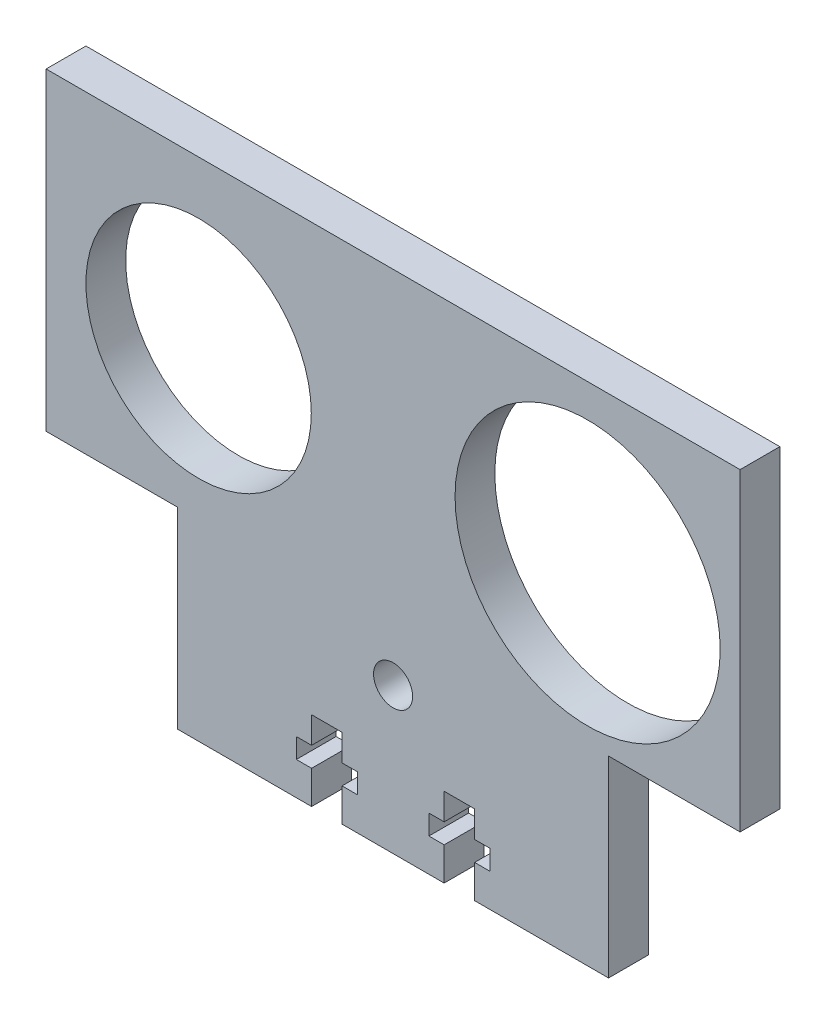
ISO-10303-21;
HEADER;
FILE_DESCRIPTION(('STEP AP214'),'2;1');
FILE_NAME('part.step','',(''),(''),'','','');
FILE_SCHEMA(('AUTOMOTIVE_DESIGN { 1 0 10303 214 1 1 1 1 }'));
ENDSEC;
DATA;
#1=APPLICATION_CONTEXT('core data for automotive mechanical design processes');
#2=APPLICATION_PROTOCOL_DEFINITION('international standard','automotive_design',2000,#1);
#3=PRODUCT_CONTEXT('',#1,'mechanical');
#4=PRODUCT('Part','Part','',(#3));
#5=PRODUCT_RELATED_PRODUCT_CATEGORY('part','',(#4));
#6=PRODUCT_DEFINITION_FORMATION('','',#4);
#7=PRODUCT_DEFINITION_CONTEXT('part definition',#1,'design');
#8=PRODUCT_DEFINITION('design','',#6,#7);
#9=PRODUCT_DEFINITION_SHAPE('','',#8);
#10=(LENGTH_UNIT() NAMED_UNIT(*) SI_UNIT(.MILLI.,.METRE.));
#11=(NAMED_UNIT(*) PLANE_ANGLE_UNIT() SI_UNIT($,.RADIAN.));
#12=(NAMED_UNIT(*) SI_UNIT($,.STERADIAN.) SOLID_ANGLE_UNIT());
#13=UNCERTAINTY_MEASURE_WITH_UNIT(LENGTH_MEASURE(1.E-05),#10,'distance_accuracy_value','');
#14=(GEOMETRIC_REPRESENTATION_CONTEXT(3) GLOBAL_UNCERTAINTY_ASSIGNED_CONTEXT((#13)) GLOBAL_UNIT_ASSIGNED_CONTEXT((#10,
#11,#12)) REPRESENTATION_CONTEXT('',''));
#15=CARTESIAN_POINT('',(0.,0.,0.));
#16=DIRECTION('',(0.,0.,1.));
#17=DIRECTION('',(1.,0.,0.));
#18=AXIS2_PLACEMENT_3D('',#15,#16,#17);
#19=CARTESIAN_POINT('',(-32.5,-22.,6.));
#20=DIRECTION('',(0.,1.,0.));
#21=DIRECTION('',(-1.,0.,0.));
#22=AXIS2_PLACEMENT_3D('',#19,#20,#21);
#23=PLANE('',#22);
#24=DIRECTION('',(1.,0.,0.));
#25=VECTOR('',#24,1.);
#26=CARTESIAN_POINT('',(-32.5,-22.,6.));
#27=LINE('',#26,#25);
#28=CARTESIAN_POINT('',(12.3,-22.,6.));
#29=VERTEX_POINT('',#28);
#30=CARTESIAN_POINT('',(32.5,-22.,6.));
#31=VERTEX_POINT('',#30);
#32=EDGE_CURVE('E465',#29,#31,#27,.T.);
#33=ORIENTED_EDGE('',*,*,#32,.F.);
#34=DIRECTION('',(0.,0.,1.));
#35=VECTOR('',#34,1.);
#36=CARTESIAN_POINT('',(12.3,-22.,0.));
#37=LINE('',#36,#35);
#38=CARTESIAN_POINT('',(12.3,-22.,0.));
#39=VERTEX_POINT('',#38);
#40=EDGE_CURVE('E336',#39,#29,#37,.T.);
#41=ORIENTED_EDGE('',*,*,#40,.F.);
#42=DIRECTION('',(1.,0.,0.));
#43=VECTOR('',#42,1.);
#44=CARTESIAN_POINT('',(-32.5,-22.,0.));
#45=LINE('',#44,#43);
#46=CARTESIAN_POINT('',(32.5,-22.,0.));
#47=VERTEX_POINT('',#46);
#48=EDGE_CURVE('E485',#39,#47,#45,.T.);
#49=ORIENTED_EDGE('',*,*,#48,.T.);
#50=DIRECTION('',(0.,0.,-1.));
#51=VECTOR('',#50,1.);
#52=CARTESIAN_POINT('',(32.5,-22.,6.));
#53=LINE('',#52,#51);
#54=EDGE_CURVE('E469',#31,#47,#53,.T.);
#55=ORIENTED_EDGE('',*,*,#54,.F.);
#56=EDGE_LOOP('',(#33,#41,#49,#55));
#57=FACE_BOUND('',#56,.T.);
#58=ADVANCED_FACE('F33',(#57),#23,.F.);
#59=CARTESIAN_POINT('',(-32.5,-22.,0.));
#60=VERTEX_POINT('',#59);
#61=CARTESIAN_POINT('',(-12.3,-22.,0.));
#62=VERTEX_POINT('',#61);
#63=EDGE_CURVE('E453',#60,#62,#45,.T.);
#64=ORIENTED_EDGE('',*,*,#63,.T.);
#65=DIRECTION('',(0.,0.,1.));
#66=VECTOR('',#65,1.);
#67=CARTESIAN_POINT('',(-12.3,-22.,0.));
#68=LINE('',#67,#66);
#69=CARTESIAN_POINT('',(-12.3,-22.,6.));
#70=VERTEX_POINT('',#69);
#71=EDGE_CURVE('E375',#62,#70,#68,.T.);
#72=ORIENTED_EDGE('',*,*,#71,.T.);
#73=CARTESIAN_POINT('',(-32.5,-22.,6.));
#74=VERTEX_POINT('',#73);
#75=EDGE_CURVE('E466',#74,#70,#27,.T.);
#76=ORIENTED_EDGE('',*,*,#75,.F.);
#77=DIRECTION('',(0.,0.,-1.));
#78=VECTOR('',#77,1.);
#79=CARTESIAN_POINT('',(-32.5,-22.,6.));
#80=LINE('',#79,#78);
#81=EDGE_CURVE('E491',#74,#60,#80,.T.);
#82=ORIENTED_EDGE('',*,*,#81,.T.);
#83=EDGE_LOOP('',(#64,#72,#76,#82));
#84=FACE_BOUND('',#83,.T.);
#85=ADVANCED_FACE('F554',(#84),#23,.F.);
#86=CARTESIAN_POINT('',(0.,0.,6.));
#87=DIRECTION('',(0.,0.,1.));
#88=DIRECTION('',(1.,0.,0.));
#89=AXIS2_PLACEMENT_3D('',#86,#87,#88);
#90=PLANE('',#89);
#91=DIRECTION('',(0.,1.,0.));
#92=VECTOR('',#91,1.);
#93=CARTESIAN_POINT('',(12.3,-22.,6.));
#94=LINE('',#93,#92);
#95=CARTESIAN_POINT('',(12.3,-17.,6.));
#96=VERTEX_POINT('',#95);
#97=EDGE_CURVE('E304',#29,#96,#94,.T.);
#98=ORIENTED_EDGE('',*,*,#97,.F.);
#99=ORIENTED_EDGE('',*,*,#32,.T.);
#100=DIRECTION('',(0.,1.,0.));
#101=VECTOR('',#100,1.);
#102=CARTESIAN_POINT('',(32.5,7.00000000000001,6.));
#103=LINE('',#102,#101);
#104=CARTESIAN_POINT('',(32.5,7.00000000000001,6.));
#105=VERTEX_POINT('',#104);
#106=EDGE_CURVE('E449',#31,#105,#103,.T.);
#107=ORIENTED_EDGE('',*,*,#106,.T.);
#108=DIRECTION('',(1.,0.,0.));
#109=VECTOR('',#108,1.);
#110=CARTESIAN_POINT('',(32.5,7.00000000000001,6.));
#111=LINE('',#110,#109);
#112=CARTESIAN_POINT('',(52.3449314192418,7.00000000000002,6.));
#113=VERTEX_POINT('',#112);
#114=EDGE_CURVE('E452',#105,#113,#111,.T.);
#115=ORIENTED_EDGE('',*,*,#114,.T.);
#116=DIRECTION('',(0.,1.,0.));
#117=VECTOR('',#116,1.);
#118=CARTESIAN_POINT('',(52.3449314192418,7.00000000000002,6.));
#119=LINE('',#118,#117);
#120=CARTESIAN_POINT('',(52.3449314192418,54.3449314192417,6.));
#121=VERTEX_POINT('',#120);
#122=EDGE_CURVE('E455',#113,#121,#119,.T.);
#123=ORIENTED_EDGE('',*,*,#122,.T.);
#124=DIRECTION('',(-1.,0.,0.));
#125=VECTOR('',#124,1.);
#126=CARTESIAN_POINT('',(-52.3449314192418,54.3449314192417,6.));
#127=LINE('',#126,#125);
#128=CARTESIAN_POINT('',(-52.3449314192418,54.3449314192417,6.));
#129=VERTEX_POINT('',#128);
#130=EDGE_CURVE('E457',#121,#129,#127,.T.);
#131=ORIENTED_EDGE('',*,*,#130,.T.);
#132=DIRECTION('',(0.,-1.,0.));
#133=VECTOR('',#132,1.);
#134=CARTESIAN_POINT('',(-52.3449314192418,7.,6.));
#135=LINE('',#134,#133);
#136=CARTESIAN_POINT('',(-52.3449314192418,7.,6.));
#137=VERTEX_POINT('',#136);
#138=EDGE_CURVE('E459',#129,#137,#135,.T.);
#139=ORIENTED_EDGE('',*,*,#138,.T.);
#140=DIRECTION('',(1.,0.,0.));
#141=VECTOR('',#140,1.);
#142=CARTESIAN_POINT('',(-32.5,7.,6.));
#143=LINE('',#142,#141);
#144=CARTESIAN_POINT('',(-32.5,7.,6.));
#145=VERTEX_POINT('',#144);
#146=EDGE_CURVE('E461',#137,#145,#143,.T.);
#147=ORIENTED_EDGE('',*,*,#146,.T.);
#148=DIRECTION('',(0.,-1.,0.));
#149=VECTOR('',#148,1.);
#150=CARTESIAN_POINT('',(-32.5,7.,6.));
#151=LINE('',#150,#149);
#152=EDGE_CURVE('E463',#145,#74,#151,.T.);
#153=ORIENTED_EDGE('',*,*,#152,.T.);
#154=ORIENTED_EDGE('',*,*,#75,.T.);
#155=DIRECTION('',(0.,-1.,0.));
#156=VECTOR('',#155,1.);
#157=CARTESIAN_POINT('',(-12.3,-22.,6.));
#158=LINE('',#157,#156);
#159=CARTESIAN_POINT('',(-12.3,-17.,6.));
#160=VERTEX_POINT('',#159);
#161=EDGE_CURVE('E323',#160,#70,#158,.T.);
#162=ORIENTED_EDGE('',*,*,#161,.F.);
#163=DIRECTION('',(1.,0.,0.));
#164=VECTOR('',#163,1.);
#165=CARTESIAN_POINT('',(-14.6,-17.,6.));
#166=LINE('',#165,#164);
#167=CARTESIAN_POINT('',(-14.6,-17.,6.));
#168=VERTEX_POINT('',#167);
#169=EDGE_CURVE('E346',#168,#160,#166,.T.);
#170=ORIENTED_EDGE('',*,*,#169,.F.);
#171=DIRECTION('',(0.,-1.,0.));
#172=VECTOR('',#171,1.);
#173=CARTESIAN_POINT('',(-14.6,-14.,6.));
#174=LINE('',#173,#172);
#175=CARTESIAN_POINT('',(-14.6,-14.,6.));
#176=VERTEX_POINT('',#175);
#177=EDGE_CURVE('E401',#176,#168,#174,.T.);
#178=ORIENTED_EDGE('',*,*,#177,.F.);
#179=DIRECTION('',(-1.,0.,0.));
#180=VECTOR('',#179,1.);
#181=CARTESIAN_POINT('',(-14.6,-14.,6.));
#182=LINE('',#181,#180);
#183=CARTESIAN_POINT('',(-12.3,-14.,6.));
#184=VERTEX_POINT('',#183);
#185=EDGE_CURVE('E398',#184,#176,#182,.T.);
#186=ORIENTED_EDGE('',*,*,#185,.F.);
#187=DIRECTION('',(0.,-1.,0.));
#188=VECTOR('',#187,1.);
#189=CARTESIAN_POINT('',(-12.3,-14.,6.));
#190=LINE('',#189,#188);
#191=CARTESIAN_POINT('',(-12.3,-10.,6.));
#192=VERTEX_POINT('',#191);
#193=EDGE_CURVE('E395',#192,#184,#190,.T.);
#194=ORIENTED_EDGE('',*,*,#193,.F.);
#195=DIRECTION('',(-1.,0.,0.));
#196=VECTOR('',#195,1.);
#197=CARTESIAN_POINT('',(-12.3,-10.,6.));
#198=LINE('',#197,#196);
#199=CARTESIAN_POINT('',(-7.7,-10.,6.));
#200=VERTEX_POINT('',#199);
#201=EDGE_CURVE('E392',#200,#192,#198,.T.);
#202=ORIENTED_EDGE('',*,*,#201,.F.);
#203=DIRECTION('',(0.,1.,0.));
#204=VECTOR('',#203,1.);
#205=CARTESIAN_POINT('',(-7.7,-14.,6.));
#206=LINE('',#205,#204);
#207=CARTESIAN_POINT('',(-7.7,-14.,6.));
#208=VERTEX_POINT('',#207);
#209=EDGE_CURVE('E389',#208,#200,#206,.T.);
#210=ORIENTED_EDGE('',*,*,#209,.F.);
#211=DIRECTION('',(-1.,0.,0.));
#212=VECTOR('',#211,1.);
#213=CARTESIAN_POINT('',(-7.7,-14.,6.));
#214=LINE('',#213,#212);
#215=CARTESIAN_POINT('',(-5.4,-14.,6.));
#216=VERTEX_POINT('',#215);
#217=EDGE_CURVE('E386',#216,#208,#214,.T.);
#218=ORIENTED_EDGE('',*,*,#217,.F.);
#219=DIRECTION('',(0.,1.,0.));
#220=VECTOR('',#219,1.);
#221=CARTESIAN_POINT('',(-5.4,-14.,6.));
#222=LINE('',#221,#220);
#223=CARTESIAN_POINT('',(-5.4,-17.,6.));
#224=VERTEX_POINT('',#223);
#225=EDGE_CURVE('E383',#224,#216,#222,.T.);
#226=ORIENTED_EDGE('',*,*,#225,.F.);
#227=DIRECTION('',(1.,0.,0.));
#228=VECTOR('',#227,1.);
#229=CARTESIAN_POINT('',(-7.7,-17.,6.));
#230=LINE('',#229,#228);
#231=CARTESIAN_POINT('',(-7.7,-17.,6.));
#232=VERTEX_POINT('',#231);
#233=EDGE_CURVE('E380',#232,#224,#230,.T.);
#234=ORIENTED_EDGE('',*,*,#233,.F.);
#235=DIRECTION('',(0.,1.,0.));
#236=VECTOR('',#235,1.);
#237=CARTESIAN_POINT('',(-7.69999999999999,-22.,6.));
#238=LINE('',#237,#236);
#239=CARTESIAN_POINT('',(-7.69999999999999,-22.,6.));
#240=VERTEX_POINT('',#239);
#241=EDGE_CURVE('E377',#240,#232,#238,.T.);
#242=ORIENTED_EDGE('',*,*,#241,.F.);
#243=CARTESIAN_POINT('',(7.7,-22.,6.));
#244=VERTEX_POINT('',#243);
#245=EDGE_CURVE('E470',#240,#244,#27,.T.);
#246=ORIENTED_EDGE('',*,*,#245,.T.);
#247=DIRECTION('',(0.,-1.,0.));
#248=VECTOR('',#247,1.);
#249=CARTESIAN_POINT('',(7.7,-22.,6.));
#250=LINE('',#249,#248);
#251=CARTESIAN_POINT('',(7.7,-17.,6.));
#252=VERTEX_POINT('',#251);
#253=EDGE_CURVE('E48',#252,#244,#250,.T.);
#254=ORIENTED_EDGE('',*,*,#253,.F.);
#255=DIRECTION('',(1.,0.,0.));
#256=VECTOR('',#255,1.);
#257=CARTESIAN_POINT('',(7.7,-17.,6.));
#258=LINE('',#257,#256);
#259=CARTESIAN_POINT('',(5.4,-17.,6.));
#260=VERTEX_POINT('',#259);
#261=EDGE_CURVE('E300',#260,#252,#258,.T.);
#262=ORIENTED_EDGE('',*,*,#261,.F.);
#263=DIRECTION('',(0.,-1.,0.));
#264=VECTOR('',#263,1.);
#265=CARTESIAN_POINT('',(5.4,-14.,6.));
#266=LINE('',#265,#264);
#267=CARTESIAN_POINT('',(5.4,-14.,6.));
#268=VERTEX_POINT('',#267);
#269=EDGE_CURVE('E298',#268,#260,#266,.T.);
#270=ORIENTED_EDGE('',*,*,#269,.F.);
#271=DIRECTION('',(-1.,0.,0.));
#272=VECTOR('',#271,1.);
#273=CARTESIAN_POINT('',(7.7,-14.,6.));
#274=LINE('',#273,#272);
#275=CARTESIAN_POINT('',(7.7,-14.,6.));
#276=VERTEX_POINT('',#275);
#277=EDGE_CURVE('E249',#276,#268,#274,.T.);
#278=ORIENTED_EDGE('',*,*,#277,.F.);
#279=DIRECTION('',(0.,-1.,0.));
#280=VECTOR('',#279,1.);
#281=CARTESIAN_POINT('',(7.7,-14.,6.));
#282=LINE('',#281,#280);
#283=CARTESIAN_POINT('',(7.7,-10.,6.));
#284=VERTEX_POINT('',#283);
#285=EDGE_CURVE('E269',#284,#276,#282,.T.);
#286=ORIENTED_EDGE('',*,*,#285,.F.);
#287=DIRECTION('',(-1.,0.,0.));
#288=VECTOR('',#287,1.);
#289=CARTESIAN_POINT('',(12.3,-9.99999999999999,6.));
#290=LINE('',#289,#288);
#291=CARTESIAN_POINT('',(12.3,-9.99999999999999,6.));
#292=VERTEX_POINT('',#291);
#293=EDGE_CURVE('E272',#292,#284,#290,.T.);
#294=ORIENTED_EDGE('',*,*,#293,.F.);
#295=DIRECTION('',(0.,1.,0.));
#296=VECTOR('',#295,1.);
#297=CARTESIAN_POINT('',(12.3,-14.,6.));
#298=LINE('',#297,#296);
#299=CARTESIAN_POINT('',(12.3,-14.,6.));
#300=VERTEX_POINT('',#299);
#301=EDGE_CURVE('E316',#300,#292,#298,.T.);
#302=ORIENTED_EDGE('',*,*,#301,.F.);
#303=DIRECTION('',(-1.,0.,0.));
#304=VECTOR('',#303,1.);
#305=CARTESIAN_POINT('',(14.6,-14.,6.));
#306=LINE('',#305,#304);
#307=CARTESIAN_POINT('',(14.6,-14.,6.));
#308=VERTEX_POINT('',#307);
#309=EDGE_CURVE('E313',#308,#300,#306,.T.);
#310=ORIENTED_EDGE('',*,*,#309,.F.);
#311=DIRECTION('',(0.,1.,0.));
#312=VECTOR('',#311,1.);
#313=CARTESIAN_POINT('',(14.6,-14.,6.));
#314=LINE('',#313,#312);
#315=CARTESIAN_POINT('',(14.6,-17.,6.));
#316=VERTEX_POINT('',#315);
#317=EDGE_CURVE('E310',#316,#308,#314,.T.);
#318=ORIENTED_EDGE('',*,*,#317,.F.);
#319=DIRECTION('',(1.,0.,0.));
#320=VECTOR('',#319,1.);
#321=CARTESIAN_POINT('',(14.6,-17.,6.));
#322=LINE('',#321,#320);
#323=EDGE_CURVE('E307',#96,#316,#322,.T.);
#324=ORIENTED_EDGE('',*,*,#323,.F.);
#325=EDGE_LOOP('',(#98,#99,#107,#115,#123,#131,#139,#147,#153,#154,#162,#170,#178,#186,#194,
#202,#210,#218,#226,#234,#242,#246,#254,#262,#270,#278,#286,#294,#302,#310,#318,#324));
#326=FACE_BOUND('',#325,.T.);
#327=CARTESIAN_POINT('',(-29.3449314192418,29.3449314192417,6.));
#328=DIRECTION('',(0.,0.,1.));
#329=DIRECTION('',(1.,0.,0.));
#330=AXIS2_PLACEMENT_3D('',#327,#328,#329);
#331=CIRCLE('',#330,17.);
#332=CARTESIAN_POINT('',(-12.3449314192418,29.3449314192417,6.));
#333=VERTEX_POINT('',#332);
#334=EDGE_CURVE('E437',#333,#333,#331,.T.);
#335=ORIENTED_EDGE('',*,*,#334,.F.);
#336=EDGE_LOOP('',(#335));
#337=FACE_BOUND('',#336,.T.);
#338=CARTESIAN_POINT('',(0.,0.,6.));
#339=DIRECTION('',(0.,0.,1.));
#340=DIRECTION('',(1.,0.,0.));
#341=AXIS2_PLACEMENT_3D('',#338,#339,#340);
#342=CIRCLE('',#341,2.95);
#343=CARTESIAN_POINT('',(2.95,0.,6.));
#344=VERTEX_POINT('',#343);
#345=EDGE_CURVE('E443',#344,#344,#342,.T.);
#346=ORIENTED_EDGE('',*,*,#345,.F.);
#347=EDGE_LOOP('',(#346));
#348=FACE_BOUND('',#347,.T.);
#349=CARTESIAN_POINT('',(29.3449314192418,29.3449314192417,6.));
#350=DIRECTION('',(0.,0.,1.));
#351=DIRECTION('',(1.,0.,0.));
#352=AXIS2_PLACEMENT_3D('',#349,#350,#351);
#353=CIRCLE('',#352,20.);
#354=CARTESIAN_POINT('',(49.3449314192418,29.3449314192417,6.));
#355=VERTEX_POINT('',#354);
#356=EDGE_CURVE('E431',#355,#355,#353,.T.);
#357=ORIENTED_EDGE('',*,*,#356,.F.);
#358=EDGE_LOOP('',(#357));
#359=FACE_BOUND('',#358,.T.);
#360=ADVANCED_FACE('F528',(#326,#337,#348,#359),#90,.T.);
#361=CARTESIAN_POINT('',(0.,0.,0.));
#362=DIRECTION('',(0.,0.,1.));
#363=DIRECTION('',(1.,0.,0.));
#364=AXIS2_PLACEMENT_3D('',#361,#362,#363);
#365=PLANE('',#364);
#366=ORIENTED_EDGE('',*,*,#48,.F.);
#367=DIRECTION('',(0.,1.,0.));
#368=VECTOR('',#367,1.);
#369=CARTESIAN_POINT('',(12.3,-22.,0.));
#370=LINE('',#369,#368);
#371=CARTESIAN_POINT('',(12.3,-17.,0.));
#372=VERTEX_POINT('',#371);
#373=EDGE_CURVE('E279',#39,#372,#370,.T.);
#374=ORIENTED_EDGE('',*,*,#373,.T.);
#375=DIRECTION('',(1.,0.,0.));
#376=VECTOR('',#375,1.);
#377=CARTESIAN_POINT('',(14.6,-17.,0.));
#378=LINE('',#377,#376);
#379=CARTESIAN_POINT('',(14.6,-17.,0.));
#380=VERTEX_POINT('',#379);
#381=EDGE_CURVE('E282',#372,#380,#378,.T.);
#382=ORIENTED_EDGE('',*,*,#381,.T.);
#383=DIRECTION('',(0.,1.,0.));
#384=VECTOR('',#383,1.);
#385=CARTESIAN_POINT('',(14.6,-14.,0.));
#386=LINE('',#385,#384);
#387=CARTESIAN_POINT('',(14.6,-14.,0.));
#388=VERTEX_POINT('',#387);
#389=EDGE_CURVE('E285',#380,#388,#386,.T.);
#390=ORIENTED_EDGE('',*,*,#389,.T.);
#391=DIRECTION('',(-1.,0.,0.));
#392=VECTOR('',#391,1.);
#393=CARTESIAN_POINT('',(14.6,-14.,0.));
#394=LINE('',#393,#392);
#395=CARTESIAN_POINT('',(12.3,-14.,0.));
#396=VERTEX_POINT('',#395);
#397=EDGE_CURVE('E288',#388,#396,#394,.T.);
#398=ORIENTED_EDGE('',*,*,#397,.T.);
#399=DIRECTION('',(0.,1.,0.));
#400=VECTOR('',#399,1.);
#401=CARTESIAN_POINT('',(12.3,-14.,0.));
#402=LINE('',#401,#400);
#403=CARTESIAN_POINT('',(12.3,-9.99999999999999,0.));
#404=VERTEX_POINT('',#403);
#405=EDGE_CURVE('E291',#396,#404,#402,.T.);
#406=ORIENTED_EDGE('',*,*,#405,.T.);
#407=DIRECTION('',(-1.,0.,0.));
#408=VECTOR('',#407,1.);
#409=CARTESIAN_POINT('',(12.3,-9.99999999999999,0.));
#410=LINE('',#409,#408);
#411=CARTESIAN_POINT('',(7.7,-10.,0.));
#412=VERTEX_POINT('',#411);
#413=EDGE_CURVE('E294',#404,#412,#410,.T.);
#414=ORIENTED_EDGE('',*,*,#413,.T.);
#415=DIRECTION('',(0.,-1.,0.));
#416=VECTOR('',#415,1.);
#417=CARTESIAN_POINT('',(7.7,-14.,0.));
#418=LINE('',#417,#416);
#419=CARTESIAN_POINT('',(7.7,-14.,0.));
#420=VERTEX_POINT('',#419);
#421=EDGE_CURVE('E254',#412,#420,#418,.T.);
#422=ORIENTED_EDGE('',*,*,#421,.T.);
#423=DIRECTION('',(-1.,0.,0.));
#424=VECTOR('',#423,1.);
#425=CARTESIAN_POINT('',(7.7,-14.,0.));
#426=LINE('',#425,#424);
#427=CARTESIAN_POINT('',(5.4,-14.,0.));
#428=VERTEX_POINT('',#427);
#429=EDGE_CURVE('E246',#420,#428,#426,.T.);
#430=ORIENTED_EDGE('',*,*,#429,.T.);
#431=DIRECTION('',(0.,-1.,0.));
#432=VECTOR('',#431,1.);
#433=CARTESIAN_POINT('',(5.4,-14.,0.));
#434=LINE('',#433,#432);
#435=CARTESIAN_POINT('',(5.4,-17.,0.));
#436=VERTEX_POINT('',#435);
#437=EDGE_CURVE('E257',#428,#436,#434,.T.);
#438=ORIENTED_EDGE('',*,*,#437,.T.);
#439=DIRECTION('',(1.,0.,0.));
#440=VECTOR('',#439,1.);
#441=CARTESIAN_POINT('',(7.7,-17.,0.));
#442=LINE('',#441,#440);
#443=CARTESIAN_POINT('',(7.7,-17.,0.));
#444=VERTEX_POINT('',#443);
#445=EDGE_CURVE('E262',#436,#444,#442,.T.);
#446=ORIENTED_EDGE('',*,*,#445,.T.);
#447=DIRECTION('',(0.,-1.,0.));
#448=VECTOR('',#447,1.);
#449=CARTESIAN_POINT('',(7.7,-22.,0.));
#450=LINE('',#449,#448);
#451=CARTESIAN_POINT('',(7.7,-22.,0.));
#452=VERTEX_POINT('',#451);
#453=EDGE_CURVE('E276',#444,#452,#450,.T.);
#454=ORIENTED_EDGE('',*,*,#453,.T.);
#455=CARTESIAN_POINT('',(-7.69999999999999,-22.,0.));
#456=VERTEX_POINT('',#455);
#457=EDGE_CURVE('E488',#456,#452,#45,.T.);
#458=ORIENTED_EDGE('',*,*,#457,.F.);
#459=DIRECTION('',(0.,1.,0.));
#460=VECTOR('',#459,1.);
#461=CARTESIAN_POINT('',(-7.69999999999999,-22.,0.));
#462=LINE('',#461,#460);
#463=CARTESIAN_POINT('',(-7.7,-17.,0.));
#464=VERTEX_POINT('',#463);
#465=EDGE_CURVE('E56',#456,#464,#462,.T.);
#466=ORIENTED_EDGE('',*,*,#465,.T.);
#467=DIRECTION('',(1.,0.,0.));
#468=VECTOR('',#467,1.);
#469=CARTESIAN_POINT('',(-7.7,-17.,0.));
#470=LINE('',#469,#468);
#471=CARTESIAN_POINT('',(-5.4,-17.,0.));
#472=VERTEX_POINT('',#471);
#473=EDGE_CURVE('E348',#464,#472,#470,.T.);
#474=ORIENTED_EDGE('',*,*,#473,.T.);
#475=DIRECTION('',(0.,1.,0.));
#476=VECTOR('',#475,1.);
#477=CARTESIAN_POINT('',(-5.4,-14.,0.));
#478=LINE('',#477,#476);
#479=CARTESIAN_POINT('',(-5.4,-14.,0.));
#480=VERTEX_POINT('',#479);
#481=EDGE_CURVE('E351',#472,#480,#478,.T.);
#482=ORIENTED_EDGE('',*,*,#481,.T.);
#483=DIRECTION('',(-1.,0.,0.));
#484=VECTOR('',#483,1.);
#485=CARTESIAN_POINT('',(-7.7,-14.,0.));
#486=LINE('',#485,#484);
#487=CARTESIAN_POINT('',(-7.7,-14.,0.));
#488=VERTEX_POINT('',#487);
#489=EDGE_CURVE('E354',#480,#488,#486,.T.);
#490=ORIENTED_EDGE('',*,*,#489,.T.);
#491=DIRECTION('',(0.,1.,0.));
#492=VECTOR('',#491,1.);
#493=CARTESIAN_POINT('',(-7.7,-14.,0.));
#494=LINE('',#493,#492);
#495=CARTESIAN_POINT('',(-7.7,-10.,0.));
#496=VERTEX_POINT('',#495);
#497=EDGE_CURVE('E357',#488,#496,#494,.T.);
#498=ORIENTED_EDGE('',*,*,#497,.T.);
#499=DIRECTION('',(-1.,0.,0.));
#500=VECTOR('',#499,1.);
#501=CARTESIAN_POINT('',(-12.3,-10.,0.));
#502=LINE('',#501,#500);
#503=CARTESIAN_POINT('',(-12.3,-10.,0.));
#504=VERTEX_POINT('',#503);
#505=EDGE_CURVE('E360',#496,#504,#502,.T.);
#506=ORIENTED_EDGE('',*,*,#505,.T.);
#507=DIRECTION('',(0.,-1.,0.));
#508=VECTOR('',#507,1.);
#509=CARTESIAN_POINT('',(-12.3,-14.,0.));
#510=LINE('',#509,#508);
#511=CARTESIAN_POINT('',(-12.3,-14.,0.));
#512=VERTEX_POINT('',#511);
#513=EDGE_CURVE('E363',#504,#512,#510,.T.);
#514=ORIENTED_EDGE('',*,*,#513,.T.);
#515=DIRECTION('',(-1.,0.,0.));
#516=VECTOR('',#515,1.);
#517=CARTESIAN_POINT('',(-14.6,-14.,0.));
#518=LINE('',#517,#516);
#519=CARTESIAN_POINT('',(-14.6,-14.,0.));
#520=VERTEX_POINT('',#519);
#521=EDGE_CURVE('E366',#512,#520,#518,.T.);
#522=ORIENTED_EDGE('',*,*,#521,.T.);
#523=DIRECTION('',(0.,-1.,0.));
#524=VECTOR('',#523,1.);
#525=CARTESIAN_POINT('',(-14.6,-14.,0.));
#526=LINE('',#525,#524);
#527=CARTESIAN_POINT('',(-14.6,-17.,0.));
#528=VERTEX_POINT('',#527);
#529=EDGE_CURVE('E369',#520,#528,#526,.T.);
#530=ORIENTED_EDGE('',*,*,#529,.T.);
#531=DIRECTION('',(1.,0.,0.));
#532=VECTOR('',#531,1.);
#533=CARTESIAN_POINT('',(-14.6,-17.,0.));
#534=LINE('',#533,#532);
#535=CARTESIAN_POINT('',(-12.3,-17.,0.));
#536=VERTEX_POINT('',#535);
#537=EDGE_CURVE('E372',#528,#536,#534,.T.);
#538=ORIENTED_EDGE('',*,*,#537,.T.);
#539=DIRECTION('',(0.,-1.,0.));
#540=VECTOR('',#539,1.);
#541=CARTESIAN_POINT('',(-12.3,-22.,0.));
#542=LINE('',#541,#540);
#543=EDGE_CURVE('E343',#536,#62,#542,.T.);
#544=ORIENTED_EDGE('',*,*,#543,.T.);
#545=ORIENTED_EDGE('',*,*,#63,.F.);
#546=DIRECTION('',(0.,-1.,0.));
#547=VECTOR('',#546,1.);
#548=CARTESIAN_POINT('',(-32.5,7.,0.));
#549=LINE('',#548,#547);
#550=CARTESIAN_POINT('',(-32.5,7.,0.));
#551=VERTEX_POINT('',#550);
#552=EDGE_CURVE('E483',#551,#60,#549,.T.);
#553=ORIENTED_EDGE('',*,*,#552,.F.);
#554=DIRECTION('',(1.,0.,0.));
#555=VECTOR('',#554,1.);
#556=CARTESIAN_POINT('',(-32.5,7.,0.));
#557=LINE('',#556,#555);
#558=CARTESIAN_POINT('',(-52.3449314192418,7.,0.));
#559=VERTEX_POINT('',#558);
#560=EDGE_CURVE('E481',#559,#551,#557,.T.);
#561=ORIENTED_EDGE('',*,*,#560,.F.);
#562=DIRECTION('',(0.,-1.,0.));
#563=VECTOR('',#562,1.);
#564=CARTESIAN_POINT('',(-52.3449314192418,7.,0.));
#565=LINE('',#564,#563);
#566=CARTESIAN_POINT('',(-52.3449314192418,54.3449314192417,0.));
#567=VERTEX_POINT('',#566);
#568=EDGE_CURVE('E479',#567,#559,#565,.T.);
#569=ORIENTED_EDGE('',*,*,#568,.F.);
#570=DIRECTION('',(-1.,0.,0.));
#571=VECTOR('',#570,1.);
#572=CARTESIAN_POINT('',(-52.3449314192418,54.3449314192417,0.));
#573=LINE('',#572,#571);
#574=CARTESIAN_POINT('',(52.3449314192418,54.3449314192417,0.));
#575=VERTEX_POINT('',#574);
#576=EDGE_CURVE('E477',#575,#567,#573,.T.);
#577=ORIENTED_EDGE('',*,*,#576,.F.);
#578=DIRECTION('',(0.,1.,0.));
#579=VECTOR('',#578,1.);
#580=CARTESIAN_POINT('',(52.3449314192418,7.00000000000002,0.));
#581=LINE('',#580,#579);
#582=CARTESIAN_POINT('',(52.3449314192418,7.00000000000002,0.));
#583=VERTEX_POINT('',#582);
#584=EDGE_CURVE('E475',#583,#575,#581,.T.);
#585=ORIENTED_EDGE('',*,*,#584,.F.);
#586=DIRECTION('',(1.,0.,0.));
#587=VECTOR('',#586,1.);
#588=CARTESIAN_POINT('',(32.5,7.00000000000001,0.));
#589=LINE('',#588,#587);
#590=CARTESIAN_POINT('',(32.5,7.00000000000001,0.));
#591=VERTEX_POINT('',#590);
#592=EDGE_CURVE('E473',#591,#583,#589,.T.);
#593=ORIENTED_EDGE('',*,*,#592,.F.);
#594=DIRECTION('',(0.,1.,0.));
#595=VECTOR('',#594,1.);
#596=CARTESIAN_POINT('',(32.5,7.00000000000001,0.));
#597=LINE('',#596,#595);
#598=EDGE_CURVE('E446',#47,#591,#597,.T.);
#599=ORIENTED_EDGE('',*,*,#598,.F.);
#600=EDGE_LOOP('',(#366,#374,#382,#390,#398,#406,#414,#422,#430,#438,#446,#454,#458,#466,#474,
#482,#490,#498,#506,#514,#522,#530,#538,#544,#545,#553,#561,#569,#577,#585,#593,#599));
#601=FACE_BOUND('',#600,.T.);
#602=CARTESIAN_POINT('',(0.,0.,0.));
#603=DIRECTION('',(0.,0.,1.));
#604=DIRECTION('',(1.,0.,0.));
#605=AXIS2_PLACEMENT_3D('',#602,#603,#604);
#606=CIRCLE('',#605,2.95);
#607=CARTESIAN_POINT('',(2.95,0.,0.));
#608=VERTEX_POINT('',#607);
#609=EDGE_CURVE('E440',#608,#608,#606,.T.);
#610=ORIENTED_EDGE('',*,*,#609,.T.);
#611=EDGE_LOOP('',(#610));
#612=FACE_BOUND('',#611,.T.);
#613=CARTESIAN_POINT('',(-29.3449314192418,29.3449314192417,0.));
#614=DIRECTION('',(0.,0.,1.));
#615=DIRECTION('',(1.,0.,0.));
#616=AXIS2_PLACEMENT_3D('',#613,#614,#615);
#617=CIRCLE('',#616,17.);
#618=CARTESIAN_POINT('',(-12.3449314192418,29.3449314192417,0.));
#619=VERTEX_POINT('',#618);
#620=EDGE_CURVE('E434',#619,#619,#617,.T.);
#621=ORIENTED_EDGE('',*,*,#620,.T.);
#622=EDGE_LOOP('',(#621));
#623=FACE_BOUND('',#622,.T.);
#624=CARTESIAN_POINT('',(29.3449314192418,29.3449314192417,0.));
#625=DIRECTION('',(0.,0.,1.));
#626=DIRECTION('',(1.,0.,0.));
#627=AXIS2_PLACEMENT_3D('',#624,#625,#626);
#628=CIRCLE('',#627,20.);
#629=CARTESIAN_POINT('',(49.3449314192418,29.3449314192417,0.));
#630=VERTEX_POINT('',#629);
#631=EDGE_CURVE('E408',#630,#630,#628,.T.);
#632=ORIENTED_EDGE('',*,*,#631,.T.);
#633=EDGE_LOOP('',(#632));
#634=FACE_BOUND('',#633,.T.);
#635=ADVANCED_FACE('F265',(#601,#612,#623,#634),#365,.F.);
#636=CARTESIAN_POINT('',(32.5,7.00000000000001,6.));
#637=DIRECTION('',(-1.,0.,0.));
#638=DIRECTION('',(0.,-1.,0.));
#639=AXIS2_PLACEMENT_3D('',#636,#637,#638);
#640=PLANE('',#639);
#641=ORIENTED_EDGE('',*,*,#598,.T.);
#642=DIRECTION('',(0.,0.,-1.));
#643=VECTOR('',#642,1.);
#644=CARTESIAN_POINT('',(32.5,7.00000000000001,6.));
#645=LINE('',#644,#643);
#646=EDGE_CURVE('E11',#105,#591,#645,.T.);
#647=ORIENTED_EDGE('',*,*,#646,.F.);
#648=ORIENTED_EDGE('',*,*,#106,.F.);
#649=ORIENTED_EDGE('',*,*,#54,.T.);
#650=EDGE_LOOP('',(#641,#647,#648,#649));
#651=FACE_BOUND('',#650,.T.);
#652=ADVANCED_FACE('F35',(#651),#640,.F.);
#653=CARTESIAN_POINT('',(32.5,7.00000000000001,6.));
#654=DIRECTION('',(0.,1.,0.));
#655=DIRECTION('',(-1.,0.,0.));
#656=AXIS2_PLACEMENT_3D('',#653,#654,#655);
#657=PLANE('',#656);
#658=ORIENTED_EDGE('',*,*,#592,.T.);
#659=DIRECTION('',(0.,0.,-1.));
#660=VECTOR('',#659,1.);
#661=CARTESIAN_POINT('',(52.3449314192418,7.00000000000002,6.));
#662=LINE('',#661,#660);
#663=EDGE_CURVE('E41',#113,#583,#662,.T.);
#664=ORIENTED_EDGE('',*,*,#663,.F.);
#665=ORIENTED_EDGE('',*,*,#114,.F.);
#666=ORIENTED_EDGE('',*,*,#646,.T.);
#667=EDGE_LOOP('',(#658,#664,#665,#666));
#668=FACE_BOUND('',#667,.T.);
#669=ADVANCED_FACE('F533',(#668),#657,.F.);
#670=CARTESIAN_POINT('',(52.3449314192418,7.00000000000002,6.));
#671=DIRECTION('',(-1.,0.,0.));
#672=DIRECTION('',(0.,-1.,0.));
#673=AXIS2_PLACEMENT_3D('',#670,#671,#672);
#674=PLANE('',#673);
#675=ORIENTED_EDGE('',*,*,#584,.T.);
#676=DIRECTION('',(0.,0.,-1.));
#677=VECTOR('',#676,1.);
#678=CARTESIAN_POINT('',(52.3449314192418,54.3449314192417,6.));
#679=LINE('',#678,#677);
#680=EDGE_CURVE('E503',#121,#575,#679,.T.);
#681=ORIENTED_EDGE('',*,*,#680,.F.);
#682=ORIENTED_EDGE('',*,*,#122,.F.);
#683=ORIENTED_EDGE('',*,*,#663,.T.);
#684=EDGE_LOOP('',(#675,#681,#682,#683));
#685=FACE_BOUND('',#684,.T.);
#686=ADVANCED_FACE('F510',(#685),#674,.F.);
#687=CARTESIAN_POINT('',(-52.3449314192418,54.3449314192417,6.));
#688=DIRECTION('',(0.,-1.,0.));
#689=DIRECTION('',(1.,0.,0.));
#690=AXIS2_PLACEMENT_3D('',#687,#688,#689);
#691=PLANE('',#690);
#692=ORIENTED_EDGE('',*,*,#576,.T.);
#693=DIRECTION('',(0.,0.,-1.));
#694=VECTOR('',#693,1.);
#695=CARTESIAN_POINT('',(-52.3449314192418,54.3449314192417,6.));
#696=LINE('',#695,#694);
#697=EDGE_CURVE('E500',#129,#567,#696,.T.);
#698=ORIENTED_EDGE('',*,*,#697,.F.);
#699=ORIENTED_EDGE('',*,*,#130,.F.);
#700=ORIENTED_EDGE('',*,*,#680,.T.);
#701=EDGE_LOOP('',(#692,#698,#699,#700));
#702=FACE_BOUND('',#701,.T.);
#703=ADVANCED_FACE('F519',(#702),#691,.F.);
#704=CARTESIAN_POINT('',(-52.3449314192418,7.,6.));
#705=DIRECTION('',(1.,0.,0.));
#706=DIRECTION('',(0.,1.,0.));
#707=AXIS2_PLACEMENT_3D('',#704,#705,#706);
#708=PLANE('',#707);
#709=ORIENTED_EDGE('',*,*,#568,.T.);
#710=DIRECTION('',(0.,0.,-1.));
#711=VECTOR('',#710,1.);
#712=CARTESIAN_POINT('',(-52.3449314192418,7.,6.));
#713=LINE('',#712,#711);
#714=EDGE_CURVE('E497',#137,#559,#713,.T.);
#715=ORIENTED_EDGE('',*,*,#714,.F.);
#716=ORIENTED_EDGE('',*,*,#138,.F.);
#717=ORIENTED_EDGE('',*,*,#697,.T.);
#718=EDGE_LOOP('',(#709,#715,#716,#717));
#719=FACE_BOUND('',#718,.T.);
#720=ADVANCED_FACE('F523',(#719),#708,.F.);
#721=CARTESIAN_POINT('',(-32.5,7.,6.));
#722=DIRECTION('',(0.,1.,0.));
#723=DIRECTION('',(-1.,0.,0.));
#724=AXIS2_PLACEMENT_3D('',#721,#722,#723);
#725=PLANE('',#724);
#726=ORIENTED_EDGE('',*,*,#560,.T.);
#727=DIRECTION('',(0.,0.,-1.));
#728=VECTOR('',#727,1.);
#729=CARTESIAN_POINT('',(-32.5,7.,6.));
#730=LINE('',#729,#728);
#731=EDGE_CURVE('E494',#145,#551,#730,.T.);
#732=ORIENTED_EDGE('',*,*,#731,.F.);
#733=ORIENTED_EDGE('',*,*,#146,.F.);
#734=ORIENTED_EDGE('',*,*,#714,.T.);
#735=EDGE_LOOP('',(#726,#732,#733,#734));
#736=FACE_BOUND('',#735,.T.);
#737=ADVANCED_FACE('F572',(#736),#725,.F.);
#738=CARTESIAN_POINT('',(-32.5,7.,6.));
#739=DIRECTION('',(1.,0.,0.));
#740=DIRECTION('',(0.,1.,0.));
#741=AXIS2_PLACEMENT_3D('',#738,#739,#740);
#742=PLANE('',#741);
#743=ORIENTED_EDGE('',*,*,#552,.T.);
#744=ORIENTED_EDGE('',*,*,#81,.F.);
#745=ORIENTED_EDGE('',*,*,#152,.F.);
#746=ORIENTED_EDGE('',*,*,#731,.T.);
#747=EDGE_LOOP('',(#743,#744,#745,#746));
#748=FACE_BOUND('',#747,.T.);
#749=ADVANCED_FACE('F564',(#748),#742,.F.);
#750=ORIENTED_EDGE('',*,*,#457,.T.);
#751=DIRECTION('',(0.,0.,1.));
#752=VECTOR('',#751,1.);
#753=CARTESIAN_POINT('',(7.7,-22.,0.));
#754=LINE('',#753,#752);
#755=EDGE_CURVE('E338',#452,#244,#754,.T.);
#756=ORIENTED_EDGE('',*,*,#755,.T.);
#757=ORIENTED_EDGE('',*,*,#245,.F.);
#758=DIRECTION('',(0.,0.,1.));
#759=VECTOR('',#758,1.);
#760=CARTESIAN_POINT('',(-7.69999999999999,-22.,0.));
#761=LINE('',#760,#759);
#762=EDGE_CURVE('E427',#456,#240,#761,.T.);
#763=ORIENTED_EDGE('',*,*,#762,.F.);
#764=EDGE_LOOP('',(#750,#756,#757,#763));
#765=FACE_BOUND('',#764,.T.);
#766=ADVANCED_FACE('F541',(#765),#23,.F.);
#767=CARTESIAN_POINT('',(0.,0.,6.));
#768=DIRECTION('',(0.,0.,-1.));
#769=DIRECTION('',(-1.,0.,0.));
#770=AXIS2_PLACEMENT_3D('',#767,#768,#769);
#771=CYLINDRICAL_SURFACE('',#770,2.95);
#772=ORIENTED_EDGE('',*,*,#345,.T.);
#773=EDGE_LOOP('',(#772));
#774=FACE_BOUND('',#773,.T.);
#775=ORIENTED_EDGE('',*,*,#609,.F.);
#776=EDGE_LOOP('',(#775));
#777=FACE_BOUND('',#776,.T.);
#778=ADVANCED_FACE('F563',(#774,#777),#771,.F.);
#779=CARTESIAN_POINT('',(-29.3449314192418,29.3449314192417,6.));
#780=DIRECTION('',(0.,0.,-1.));
#781=DIRECTION('',(-1.,0.,0.));
#782=AXIS2_PLACEMENT_3D('',#779,#780,#781);
#783=CYLINDRICAL_SURFACE('',#782,17.);
#784=ORIENTED_EDGE('',*,*,#334,.T.);
#785=EDGE_LOOP('',(#784));
#786=FACE_BOUND('',#785,.T.);
#787=ORIENTED_EDGE('',*,*,#620,.F.);
#788=EDGE_LOOP('',(#787));
#789=FACE_BOUND('',#788,.T.);
#790=ADVANCED_FACE('F569',(#786,#789),#783,.F.);
#791=CARTESIAN_POINT('',(29.3449314192418,29.3449314192417,6.));
#792=DIRECTION('',(0.,0.,-1.));
#793=DIRECTION('',(-1.,0.,0.));
#794=AXIS2_PLACEMENT_3D('',#791,#792,#793);
#795=CYLINDRICAL_SURFACE('',#794,20.);
#796=ORIENTED_EDGE('',*,*,#356,.T.);
#797=EDGE_LOOP('',(#796));
#798=FACE_BOUND('',#797,.T.);
#799=ORIENTED_EDGE('',*,*,#631,.F.);
#800=EDGE_LOOP('',(#799));
#801=FACE_BOUND('',#800,.T.);
#802=ADVANCED_FACE('F599',(#798,#801),#795,.F.);
#803=CARTESIAN_POINT('',(-12.3,-22.,0.));
#804=DIRECTION('',(-1.,0.,0.));
#805=DIRECTION('',(0.,0.,1.));
#806=AXIS2_PLACEMENT_3D('',#803,#804,#805);
#807=PLANE('',#806);
#808=ORIENTED_EDGE('',*,*,#161,.T.);
#809=ORIENTED_EDGE('',*,*,#71,.F.);
#810=ORIENTED_EDGE('',*,*,#543,.F.);
#811=DIRECTION('',(0.,0.,1.));
#812=VECTOR('',#811,1.);
#813=CARTESIAN_POINT('',(-12.3,-17.,0.));
#814=LINE('',#813,#812);
#815=EDGE_CURVE('E406',#536,#160,#814,.T.);
#816=ORIENTED_EDGE('',*,*,#815,.T.);
#817=EDGE_LOOP('',(#808,#809,#810,#816));
#818=FACE_BOUND('',#817,.T.);
#819=ADVANCED_FACE('F603',(#818),#807,.F.);
#820=CARTESIAN_POINT('',(-14.6,-17.,0.));
#821=DIRECTION('',(0.,-1.,0.));
#822=DIRECTION('',(0.,0.,-1.));
#823=AXIS2_PLACEMENT_3D('',#820,#821,#822);
#824=PLANE('',#823);
#825=ORIENTED_EDGE('',*,*,#169,.T.);
#826=ORIENTED_EDGE('',*,*,#815,.F.);
#827=ORIENTED_EDGE('',*,*,#537,.F.);
#828=DIRECTION('',(0.,0.,1.));
#829=VECTOR('',#828,1.);
#830=CARTESIAN_POINT('',(-14.6,-17.,0.));
#831=LINE('',#830,#829);
#832=EDGE_CURVE('E409',#528,#168,#831,.T.);
#833=ORIENTED_EDGE('',*,*,#832,.T.);
#834=EDGE_LOOP('',(#825,#826,#827,#833));
#835=FACE_BOUND('',#834,.T.);
#836=ADVANCED_FACE('F607',(#835),#824,.F.);
#837=CARTESIAN_POINT('',(-14.6,-14.,0.));
#838=DIRECTION('',(-1.,0.,0.));
#839=DIRECTION('',(0.,-1.,0.));
#840=AXIS2_PLACEMENT_3D('',#837,#838,#839);
#841=PLANE('',#840);
#842=ORIENTED_EDGE('',*,*,#177,.T.);
#843=ORIENTED_EDGE('',*,*,#832,.F.);
#844=ORIENTED_EDGE('',*,*,#529,.F.);
#845=DIRECTION('',(0.,0.,1.));
#846=VECTOR('',#845,1.);
#847=CARTESIAN_POINT('',(-14.6,-14.,0.));
#848=LINE('',#847,#846);
#849=EDGE_CURVE('E411',#520,#176,#848,.T.);
#850=ORIENTED_EDGE('',*,*,#849,.T.);
#851=EDGE_LOOP('',(#842,#843,#844,#850));
#852=FACE_BOUND('',#851,.T.);
#853=ADVANCED_FACE('F639',(#852),#841,.F.);
#854=CARTESIAN_POINT('',(-14.6,-14.,0.));
#855=DIRECTION('',(0.,1.,0.));
#856=DIRECTION('',(0.,0.,1.));
#857=AXIS2_PLACEMENT_3D('',#854,#855,#856);
#858=PLANE('',#857);
#859=ORIENTED_EDGE('',*,*,#185,.T.);
#860=ORIENTED_EDGE('',*,*,#849,.F.);
#861=ORIENTED_EDGE('',*,*,#521,.F.);
#862=DIRECTION('',(0.,0.,1.));
#863=VECTOR('',#862,1.);
#864=CARTESIAN_POINT('',(-12.3,-14.,0.));
#865=LINE('',#864,#863);
#866=EDGE_CURVE('E413',#512,#184,#865,.T.);
#867=ORIENTED_EDGE('',*,*,#866,.T.);
#868=EDGE_LOOP('',(#859,#860,#861,#867));
#869=FACE_BOUND('',#868,.T.);
#870=ADVANCED_FACE('F635',(#869),#858,.F.);
#871=CARTESIAN_POINT('',(-12.3,-14.,0.));
#872=DIRECTION('',(-1.,0.,0.));
#873=DIRECTION('',(0.,0.,1.));
#874=AXIS2_PLACEMENT_3D('',#871,#872,#873);
#875=PLANE('',#874);
#876=ORIENTED_EDGE('',*,*,#193,.T.);
#877=ORIENTED_EDGE('',*,*,#866,.F.);
#878=ORIENTED_EDGE('',*,*,#513,.F.);
#879=DIRECTION('',(0.,0.,1.));
#880=VECTOR('',#879,1.);
#881=CARTESIAN_POINT('',(-12.3,-10.,0.));
#882=LINE('',#881,#880);
#883=EDGE_CURVE('E415',#504,#192,#882,.T.);
#884=ORIENTED_EDGE('',*,*,#883,.T.);
#885=EDGE_LOOP('',(#876,#877,#878,#884));
#886=FACE_BOUND('',#885,.T.);
#887=ADVANCED_FACE('F631',(#886),#875,.F.);
#888=CARTESIAN_POINT('',(-12.3,-10.,0.));
#889=DIRECTION('',(0.,1.,0.));
#890=DIRECTION('',(0.,0.,1.));
#891=AXIS2_PLACEMENT_3D('',#888,#889,#890);
#892=PLANE('',#891);
#893=ORIENTED_EDGE('',*,*,#201,.T.);
#894=ORIENTED_EDGE('',*,*,#883,.F.);
#895=ORIENTED_EDGE('',*,*,#505,.F.);
#896=DIRECTION('',(0.,0.,1.));
#897=VECTOR('',#896,1.);
#898=CARTESIAN_POINT('',(-7.7,-10.,0.));
#899=LINE('',#898,#897);
#900=EDGE_CURVE('E417',#496,#200,#899,.T.);
#901=ORIENTED_EDGE('',*,*,#900,.T.);
#902=EDGE_LOOP('',(#893,#894,#895,#901));
#903=FACE_BOUND('',#902,.T.);
#904=ADVANCED_FACE('F627',(#903),#892,.F.);
#905=CARTESIAN_POINT('',(-7.7,-14.,0.));
#906=DIRECTION('',(1.,0.,0.));
#907=DIRECTION('',(0.,1.,0.));
#908=AXIS2_PLACEMENT_3D('',#905,#906,#907);
#909=PLANE('',#908);
#910=ORIENTED_EDGE('',*,*,#209,.T.);
#911=ORIENTED_EDGE('',*,*,#900,.F.);
#912=ORIENTED_EDGE('',*,*,#497,.F.);
#913=DIRECTION('',(0.,0.,1.));
#914=VECTOR('',#913,1.);
#915=CARTESIAN_POINT('',(-7.7,-14.,0.));
#916=LINE('',#915,#914);
#917=EDGE_CURVE('E419',#488,#208,#916,.T.);
#918=ORIENTED_EDGE('',*,*,#917,.T.);
#919=EDGE_LOOP('',(#910,#911,#912,#918));
#920=FACE_BOUND('',#919,.T.);
#921=ADVANCED_FACE('F623',(#920),#909,.F.);
#922=CARTESIAN_POINT('',(-7.7,-14.,0.));
#923=DIRECTION('',(0.,1.,0.));
#924=DIRECTION('',(-1.,0.,0.));
#925=AXIS2_PLACEMENT_3D('',#922,#923,#924);
#926=PLANE('',#925);
#927=ORIENTED_EDGE('',*,*,#217,.T.);
#928=ORIENTED_EDGE('',*,*,#917,.F.);
#929=ORIENTED_EDGE('',*,*,#489,.F.);
#930=DIRECTION('',(0.,0.,1.));
#931=VECTOR('',#930,1.);
#932=CARTESIAN_POINT('',(-5.4,-14.,0.));
#933=LINE('',#932,#931);
#934=EDGE_CURVE('E421',#480,#216,#933,.T.);
#935=ORIENTED_EDGE('',*,*,#934,.T.);
#936=EDGE_LOOP('',(#927,#928,#929,#935));
#937=FACE_BOUND('',#936,.T.);
#938=ADVANCED_FACE('F619',(#937),#926,.F.);
#939=CARTESIAN_POINT('',(-5.4,-14.,0.));
#940=DIRECTION('',(1.,0.,0.));
#941=DIRECTION('',(0.,1.,0.));
#942=AXIS2_PLACEMENT_3D('',#939,#940,#941);
#943=PLANE('',#942);
#944=ORIENTED_EDGE('',*,*,#225,.T.);
#945=ORIENTED_EDGE('',*,*,#934,.F.);
#946=ORIENTED_EDGE('',*,*,#481,.F.);
#947=DIRECTION('',(0.,0.,1.));
#948=VECTOR('',#947,1.);
#949=CARTESIAN_POINT('',(-5.4,-17.,0.));
#950=LINE('',#949,#948);
#951=EDGE_CURVE('E423',#472,#224,#950,.T.);
#952=ORIENTED_EDGE('',*,*,#951,.T.);
#953=EDGE_LOOP('',(#944,#945,#946,#952));
#954=FACE_BOUND('',#953,.T.);
#955=ADVANCED_FACE('F615',(#954),#943,.F.);
#956=CARTESIAN_POINT('',(-7.7,-17.,0.));
#957=DIRECTION('',(0.,-1.,0.));
#958=DIRECTION('',(0.,0.,-1.));
#959=AXIS2_PLACEMENT_3D('',#956,#957,#958);
#960=PLANE('',#959);
#961=ORIENTED_EDGE('',*,*,#233,.T.);
#962=ORIENTED_EDGE('',*,*,#951,.F.);
#963=ORIENTED_EDGE('',*,*,#473,.F.);
#964=DIRECTION('',(0.,0.,1.));
#965=VECTOR('',#964,1.);
#966=CARTESIAN_POINT('',(-7.7,-17.,0.));
#967=LINE('',#966,#965);
#968=EDGE_CURVE('E425',#464,#232,#967,.T.);
#969=ORIENTED_EDGE('',*,*,#968,.T.);
#970=EDGE_LOOP('',(#961,#962,#963,#969));
#971=FACE_BOUND('',#970,.T.);
#972=ADVANCED_FACE('F612',(#971),#960,.F.);
#973=CARTESIAN_POINT('',(-7.69999999999999,-22.,0.));
#974=DIRECTION('',(1.,0.,0.));
#975=DIRECTION('',(0.,1.,0.));
#976=AXIS2_PLACEMENT_3D('',#973,#974,#975);
#977=PLANE('',#976);
#978=ORIENTED_EDGE('',*,*,#241,.T.);
#979=ORIENTED_EDGE('',*,*,#968,.F.);
#980=ORIENTED_EDGE('',*,*,#465,.F.);
#981=ORIENTED_EDGE('',*,*,#762,.T.);
#982=EDGE_LOOP('',(#978,#979,#980,#981));
#983=FACE_BOUND('',#982,.T.);
#984=ADVANCED_FACE('F609',(#983),#977,.F.);
#985=CARTESIAN_POINT('',(7.7,-14.,0.));
#986=DIRECTION('',(0.,1.,0.));
#987=DIRECTION('',(-1.,0.,0.));
#988=AXIS2_PLACEMENT_3D('',#985,#986,#987);
#989=PLANE('',#988);
#990=ORIENTED_EDGE('',*,*,#277,.T.);
#991=DIRECTION('',(0.,0.,1.));
#992=VECTOR('',#991,1.);
#993=CARTESIAN_POINT('',(5.4,-14.,0.));
#994=LINE('',#993,#992);
#995=EDGE_CURVE('E242',#428,#268,#994,.T.);
#996=ORIENTED_EDGE('',*,*,#995,.F.);
#997=ORIENTED_EDGE('',*,*,#429,.F.);
#998=DIRECTION('',(0.,0.,1.));
#999=VECTOR('',#998,1.);
#1000=CARTESIAN_POINT('',(7.7,-14.,0.));
#1001=LINE('',#1000,#999);
#1002=EDGE_CURVE('E321',#420,#276,#1001,.T.);
#1003=ORIENTED_EDGE('',*,*,#1002,.T.);
#1004=EDGE_LOOP('',(#990,#996,#997,#1003));
#1005=FACE_BOUND('',#1004,.T.);
#1006=ADVANCED_FACE('F244',(#1005),#989,.F.);
#1007=CARTESIAN_POINT('',(7.7,-14.,0.));
#1008=DIRECTION('',(-1.,0.,0.));
#1009=DIRECTION('',(0.,0.,1.));
#1010=AXIS2_PLACEMENT_3D('',#1007,#1008,#1009);
#1011=PLANE('',#1010);
#1012=ORIENTED_EDGE('',*,*,#285,.T.);
#1013=ORIENTED_EDGE('',*,*,#1002,.F.);
#1014=ORIENTED_EDGE('',*,*,#421,.F.);
#1015=DIRECTION('',(0.,0.,1.));
#1016=VECTOR('',#1015,1.);
#1017=CARTESIAN_POINT('',(7.7,-10.,0.));
#1018=LINE('',#1017,#1016);
#1019=EDGE_CURVE('E324',#412,#284,#1018,.T.);
#1020=ORIENTED_EDGE('',*,*,#1019,.T.);
#1021=EDGE_LOOP('',(#1012,#1013,#1014,#1020));
#1022=FACE_BOUND('',#1021,.T.);
#1023=ADVANCED_FACE('F649',(#1022),#1011,.F.);
#1024=CARTESIAN_POINT('',(12.3,-9.99999999999999,0.));
#1025=DIRECTION('',(0.,1.,0.));
#1026=DIRECTION('',(-1.,0.,0.));
#1027=AXIS2_PLACEMENT_3D('',#1024,#1025,#1026);
#1028=PLANE('',#1027);
#1029=ORIENTED_EDGE('',*,*,#293,.T.);
#1030=ORIENTED_EDGE('',*,*,#1019,.F.);
#1031=ORIENTED_EDGE('',*,*,#413,.F.);
#1032=DIRECTION('',(0.,0.,1.));
#1033=VECTOR('',#1032,1.);
#1034=CARTESIAN_POINT('',(12.3,-9.99999999999999,0.));
#1035=LINE('',#1034,#1033);
#1036=EDGE_CURVE('E326',#404,#292,#1035,.T.);
#1037=ORIENTED_EDGE('',*,*,#1036,.T.);
#1038=EDGE_LOOP('',(#1029,#1030,#1031,#1037));
#1039=FACE_BOUND('',#1038,.T.);
#1040=ADVANCED_FACE('F675',(#1039),#1028,.F.);
#1041=CARTESIAN_POINT('',(12.3,-14.,0.));
#1042=DIRECTION('',(1.,0.,0.));
#1043=DIRECTION('',(0.,0.,-1.));
#1044=AXIS2_PLACEMENT_3D('',#1041,#1042,#1043);
#1045=PLANE('',#1044);
#1046=ORIENTED_EDGE('',*,*,#301,.T.);
#1047=ORIENTED_EDGE('',*,*,#1036,.F.);
#1048=ORIENTED_EDGE('',*,*,#405,.F.);
#1049=DIRECTION('',(0.,0.,1.));
#1050=VECTOR('',#1049,1.);
#1051=CARTESIAN_POINT('',(12.3,-14.,0.));
#1052=LINE('',#1051,#1050);
#1053=EDGE_CURVE('E328',#396,#300,#1052,.T.);
#1054=ORIENTED_EDGE('',*,*,#1053,.T.);
#1055=EDGE_LOOP('',(#1046,#1047,#1048,#1054));
#1056=FACE_BOUND('',#1055,.T.);
#1057=ADVANCED_FACE('F671',(#1056),#1045,.F.);
#1058=CARTESIAN_POINT('',(14.6,-14.,0.));
#1059=DIRECTION('',(0.,1.,0.));
#1060=DIRECTION('',(0.,0.,1.));
#1061=AXIS2_PLACEMENT_3D('',#1058,#1059,#1060);
#1062=PLANE('',#1061);
#1063=ORIENTED_EDGE('',*,*,#309,.T.);
#1064=ORIENTED_EDGE('',*,*,#1053,.F.);
#1065=ORIENTED_EDGE('',*,*,#397,.F.);
#1066=DIRECTION('',(0.,0.,1.));
#1067=VECTOR('',#1066,1.);
#1068=CARTESIAN_POINT('',(14.6,-14.,0.));
#1069=LINE('',#1068,#1067);
#1070=EDGE_CURVE('E330',#388,#308,#1069,.T.);
#1071=ORIENTED_EDGE('',*,*,#1070,.T.);
#1072=EDGE_LOOP('',(#1063,#1064,#1065,#1071));
#1073=FACE_BOUND('',#1072,.T.);
#1074=ADVANCED_FACE('F667',(#1073),#1062,.F.);
#1075=CARTESIAN_POINT('',(14.6,-14.,0.));
#1076=DIRECTION('',(1.,0.,0.));
#1077=DIRECTION('',(0.,1.,0.));
#1078=AXIS2_PLACEMENT_3D('',#1075,#1076,#1077);
#1079=PLANE('',#1078);
#1080=ORIENTED_EDGE('',*,*,#317,.T.);
#1081=ORIENTED_EDGE('',*,*,#1070,.F.);
#1082=ORIENTED_EDGE('',*,*,#389,.F.);
#1083=DIRECTION('',(0.,0.,1.));
#1084=VECTOR('',#1083,1.);
#1085=CARTESIAN_POINT('',(14.6,-17.,0.));
#1086=LINE('',#1085,#1084);
#1087=EDGE_CURVE('E332',#380,#316,#1086,.T.);
#1088=ORIENTED_EDGE('',*,*,#1087,.T.);
#1089=EDGE_LOOP('',(#1080,#1081,#1082,#1088));
#1090=FACE_BOUND('',#1089,.T.);
#1091=ADVANCED_FACE('F663',(#1090),#1079,.F.);
#1092=CARTESIAN_POINT('',(14.6,-17.,0.));
#1093=DIRECTION('',(0.,-1.,0.));
#1094=DIRECTION('',(0.,0.,-1.));
#1095=AXIS2_PLACEMENT_3D('',#1092,#1093,#1094);
#1096=PLANE('',#1095);
#1097=ORIENTED_EDGE('',*,*,#323,.T.);
#1098=ORIENTED_EDGE('',*,*,#1087,.F.);
#1099=ORIENTED_EDGE('',*,*,#381,.F.);
#1100=DIRECTION('',(0.,0.,1.));
#1101=VECTOR('',#1100,1.);
#1102=CARTESIAN_POINT('',(12.3,-17.,0.));
#1103=LINE('',#1102,#1101);
#1104=EDGE_CURVE('E334',#372,#96,#1103,.T.);
#1105=ORIENTED_EDGE('',*,*,#1104,.T.);
#1106=EDGE_LOOP('',(#1097,#1098,#1099,#1105));
#1107=FACE_BOUND('',#1106,.T.);
#1108=ADVANCED_FACE('F659',(#1107),#1096,.F.);
#1109=CARTESIAN_POINT('',(12.3,-22.,0.));
#1110=DIRECTION('',(1.,0.,0.));
#1111=DIRECTION('',(0.,1.,0.));
#1112=AXIS2_PLACEMENT_3D('',#1109,#1110,#1111);
#1113=PLANE('',#1112);
#1114=ORIENTED_EDGE('',*,*,#97,.T.);
#1115=ORIENTED_EDGE('',*,*,#1104,.F.);
#1116=ORIENTED_EDGE('',*,*,#373,.F.);
#1117=ORIENTED_EDGE('',*,*,#40,.T.);
#1118=EDGE_LOOP('',(#1114,#1115,#1116,#1117));
#1119=FACE_BOUND('',#1118,.T.);
#1120=ADVANCED_FACE('F656',(#1119),#1113,.F.);
#1121=CARTESIAN_POINT('',(7.7,-22.,0.));
#1122=DIRECTION('',(-1.,0.,0.));
#1123=DIRECTION('',(0.,0.,1.));
#1124=AXIS2_PLACEMENT_3D('',#1121,#1122,#1123);
#1125=PLANE('',#1124);
#1126=ORIENTED_EDGE('',*,*,#253,.T.);
#1127=ORIENTED_EDGE('',*,*,#755,.F.);
#1128=ORIENTED_EDGE('',*,*,#453,.F.);
#1129=DIRECTION('',(0.,0.,1.));
#1130=VECTOR('',#1129,1.);
#1131=CARTESIAN_POINT('',(7.7,-17.,0.));
#1132=LINE('',#1131,#1130);
#1133=EDGE_CURVE('E340',#444,#252,#1132,.T.);
#1134=ORIENTED_EDGE('',*,*,#1133,.T.);
#1135=EDGE_LOOP('',(#1126,#1127,#1128,#1134));
#1136=FACE_BOUND('',#1135,.T.);
#1137=ADVANCED_FACE('F545',(#1136),#1125,.F.);
#1138=CARTESIAN_POINT('',(7.7,-17.,0.));
#1139=DIRECTION('',(0.,-1.,0.));
#1140=DIRECTION('',(1.,0.,0.));
#1141=AXIS2_PLACEMENT_3D('',#1138,#1139,#1140);
#1142=PLANE('',#1141);
#1143=ORIENTED_EDGE('',*,*,#261,.T.);
#1144=ORIENTED_EDGE('',*,*,#1133,.F.);
#1145=ORIENTED_EDGE('',*,*,#445,.F.);
#1146=DIRECTION('',(0.,0.,1.));
#1147=VECTOR('',#1146,1.);
#1148=CARTESIAN_POINT('',(5.4,-17.,0.));
#1149=LINE('',#1148,#1147);
#1150=EDGE_CURVE('E253',#436,#260,#1149,.T.);
#1151=ORIENTED_EDGE('',*,*,#1150,.T.);
#1152=EDGE_LOOP('',(#1143,#1144,#1145,#1151));
#1153=FACE_BOUND('',#1152,.T.);
#1154=ADVANCED_FACE('F548',(#1153),#1142,.F.);
#1155=CARTESIAN_POINT('',(5.4,-14.,0.));
#1156=DIRECTION('',(-1.,0.,0.));
#1157=DIRECTION('',(0.,-1.,0.));
#1158=AXIS2_PLACEMENT_3D('',#1155,#1156,#1157);
#1159=PLANE('',#1158);
#1160=ORIENTED_EDGE('',*,*,#269,.T.);
#1161=ORIENTED_EDGE('',*,*,#1150,.F.);
#1162=ORIENTED_EDGE('',*,*,#437,.F.);
#1163=ORIENTED_EDGE('',*,*,#995,.T.);
#1164=EDGE_LOOP('',(#1160,#1161,#1162,#1163));
#1165=FACE_BOUND('',#1164,.T.);
#1166=ADVANCED_FACE('F258',(#1165),#1159,.F.);
#1167=CLOSED_SHELL('',(#58,#85,#360,#635,#652,#669,#686,#703,#720,#737,#749,#766,#778,#790,#802,
#819,#836,#853,#870,#887,#904,#921,#938,#955,#972,#984,#1006,#1023,#1040,#1057,#1074,#1091,
#1108,#1120,#1137,#1154,#1166));
#1168=MANIFOLD_SOLID_BREP('B2',#1167);
#1169=ADVANCED_BREP_SHAPE_REPRESENTATION('',(#18,#1168),#14);
#1170=SHAPE_DEFINITION_REPRESENTATION(#9,#1169);
ENDSEC;
END-ISO-10303-21;
